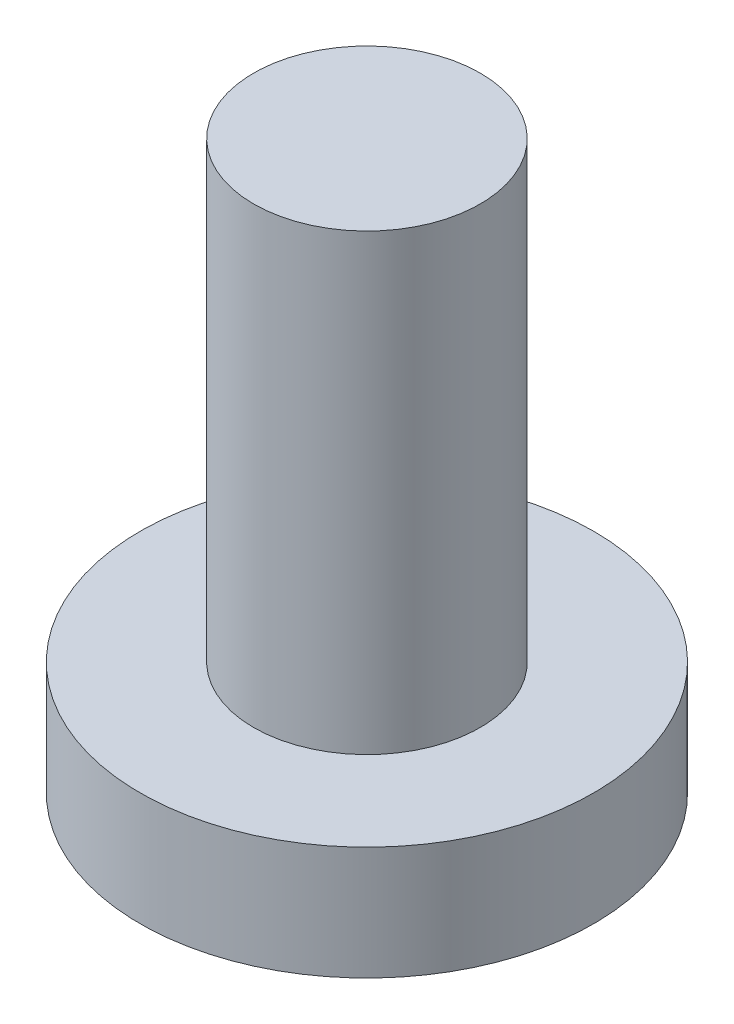
ISO-10303-21;
HEADER;
FILE_DESCRIPTION(('STEP AP214'),'2;1');
FILE_NAME('part.step','',(''),(''),'','','');
FILE_SCHEMA(('AUTOMOTIVE_DESIGN { 1 0 10303 214 1 1 1 1 }'));
ENDSEC;
DATA;
#1=APPLICATION_CONTEXT('core data for automotive mechanical design processes');
#2=APPLICATION_PROTOCOL_DEFINITION('international standard','automotive_design',2000,#1);
#3=PRODUCT_CONTEXT('',#1,'mechanical');
#4=PRODUCT('Part','Part','',(#3));
#5=PRODUCT_RELATED_PRODUCT_CATEGORY('part','',(#4));
#6=PRODUCT_DEFINITION_FORMATION('','',#4);
#7=PRODUCT_DEFINITION_CONTEXT('part definition',#1,'design');
#8=PRODUCT_DEFINITION('design','',#6,#7);
#9=PRODUCT_DEFINITION_SHAPE('','',#8);
#10=(LENGTH_UNIT() NAMED_UNIT(*) SI_UNIT(.MILLI.,.METRE.));
#11=(NAMED_UNIT(*) PLANE_ANGLE_UNIT() SI_UNIT($,.RADIAN.));
#12=(NAMED_UNIT(*) SI_UNIT($,.STERADIAN.) SOLID_ANGLE_UNIT());
#13=UNCERTAINTY_MEASURE_WITH_UNIT(LENGTH_MEASURE(1.E-05),#10,'distance_accuracy_value','');
#14=(GEOMETRIC_REPRESENTATION_CONTEXT(3) GLOBAL_UNCERTAINTY_ASSIGNED_CONTEXT((#13)) GLOBAL_UNIT_ASSIGNED_CONTEXT((#10,
#11,#12)) REPRESENTATION_CONTEXT('',''));
#15=CARTESIAN_POINT('',(0.,0.,0.));
#16=DIRECTION('',(0.,0.,1.));
#17=DIRECTION('',(1.,0.,0.));
#18=AXIS2_PLACEMENT_3D('',#15,#16,#17);
#19=CARTESIAN_POINT('',(0.,10.,0.));
#20=DIRECTION('',(0.,1.,0.));
#21=DIRECTION('',(0.,0.,1.));
#22=AXIS2_PLACEMENT_3D('',#19,#20,#21);
#23=PLANE('',#22);
#24=CARTESIAN_POINT('',(0.,10.,0.));
#25=DIRECTION('',(0.,-1.,0.));
#26=DIRECTION('',(0.,0.,-1.));
#27=AXIS2_PLACEMENT_3D('',#24,#25,#26);
#28=CIRCLE('',#27,2.);
#29=CARTESIAN_POINT('',(0.,10.,-2.));
#30=VERTEX_POINT('',#29);
#31=EDGE_CURVE('E47',#30,#30,#28,.T.);
#32=ORIENTED_EDGE('',*,*,#31,.F.);
#33=EDGE_LOOP('',(#32));
#34=FACE_BOUND('',#33,.T.);
#35=ADVANCED_FACE('F33',(#34),#23,.T.);
#36=CARTESIAN_POINT('',(0.,0.,0.));
#37=DIRECTION('',(0.,-1.,0.));
#38=DIRECTION('',(0.,0.,-1.));
#39=AXIS2_PLACEMENT_3D('',#36,#37,#38);
#40=PLANE('',#39);
#41=CARTESIAN_POINT('',(0.,0.,0.));
#42=DIRECTION('',(0.,-1.,0.));
#43=DIRECTION('',(0.,0.,-1.));
#44=AXIS2_PLACEMENT_3D('',#41,#42,#43);
#45=CIRCLE('',#44,4.);
#46=CARTESIAN_POINT('',(0.,0.,-4.));
#47=VERTEX_POINT('',#46);
#48=EDGE_CURVE('E10',#47,#47,#45,.T.);
#49=ORIENTED_EDGE('',*,*,#48,.T.);
#50=EDGE_LOOP('',(#49));
#51=FACE_BOUND('',#50,.T.);
#52=ADVANCED_FACE('F57',(#51),#40,.T.);
#53=CARTESIAN_POINT('',(0.,-3.36708860759494,0.));
#54=DIRECTION('',(0.,-1.,0.));
#55=DIRECTION('',(0.,0.,-1.));
#56=AXIS2_PLACEMENT_3D('',#53,#54,#55);
#57=CYLINDRICAL_SURFACE('',#56,4.);
#58=CARTESIAN_POINT('',(0.,2.,0.));
#59=DIRECTION('',(0.,-1.,0.));
#60=DIRECTION('',(0.,0.,-1.));
#61=AXIS2_PLACEMENT_3D('',#58,#59,#60);
#62=CIRCLE('',#61,4.);
#63=CARTESIAN_POINT('',(0.,2.,-4.));
#64=VERTEX_POINT('',#63);
#65=EDGE_CURVE('E39',#64,#64,#62,.T.);
#66=ORIENTED_EDGE('',*,*,#65,.T.);
#67=EDGE_LOOP('',(#66));
#68=FACE_BOUND('',#67,.T.);
#69=ORIENTED_EDGE('',*,*,#48,.F.);
#70=EDGE_LOOP('',(#69));
#71=FACE_BOUND('',#70,.T.);
#72=ADVANCED_FACE('F61',(#68,#71),#57,.T.);
#73=CARTESIAN_POINT('',(0.,2.,0.));
#74=DIRECTION('',(0.,1.,0.));
#75=DIRECTION('',(0.,0.,1.));
#76=AXIS2_PLACEMENT_3D('',#73,#74,#75);
#77=PLANE('',#76);
#78=CARTESIAN_POINT('',(0.,2.,0.));
#79=DIRECTION('',(0.,-1.,0.));
#80=DIRECTION('',(0.,0.,-1.));
#81=AXIS2_PLACEMENT_3D('',#78,#79,#80);
#82=CIRCLE('',#81,2.);
#83=CARTESIAN_POINT('',(0.,2.,-2.));
#84=VERTEX_POINT('',#83);
#85=EDGE_CURVE('E43',#84,#84,#82,.T.);
#86=ORIENTED_EDGE('',*,*,#85,.T.);
#87=EDGE_LOOP('',(#86));
#88=FACE_BOUND('',#87,.T.);
#89=ORIENTED_EDGE('',*,*,#65,.F.);
#90=EDGE_LOOP('',(#89));
#91=FACE_BOUND('',#90,.T.);
#92=ADVANCED_FACE('F65',(#88,#91),#77,.T.);
#93=CARTESIAN_POINT('',(0.,-3.36708860759494,0.));
#94=DIRECTION('',(0.,-1.,0.));
#95=DIRECTION('',(0.,0.,-1.));
#96=AXIS2_PLACEMENT_3D('',#93,#94,#95);
#97=CYLINDRICAL_SURFACE('',#96,2.);
#98=ORIENTED_EDGE('',*,*,#31,.T.);
#99=EDGE_LOOP('',(#98));
#100=FACE_BOUND('',#99,.T.);
#101=ORIENTED_EDGE('',*,*,#85,.F.);
#102=EDGE_LOOP('',(#101));
#103=FACE_BOUND('',#102,.T.);
#104=ADVANCED_FACE('F53',(#100,#103),#97,.T.);
#105=CLOSED_SHELL('',(#35,#52,#72,#92,#104));
#106=MANIFOLD_SOLID_BREP('B2',#105);
#107=ADVANCED_BREP_SHAPE_REPRESENTATION('',(#18,#106),#14);
#108=SHAPE_DEFINITION_REPRESENTATION(#9,#107);
ENDSEC;
END-ISO-10303-21;
